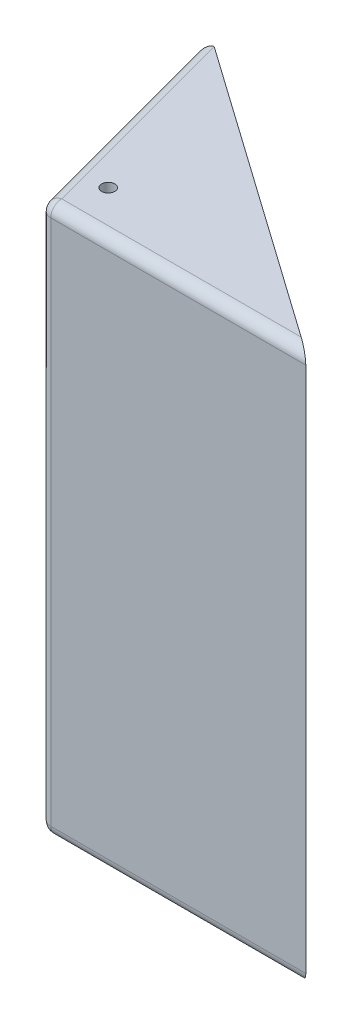
ISO-10303-21;
HEADER;
FILE_DESCRIPTION(('STEP AP214'),'2;1');
FILE_NAME('part.step','',(''),(''),'','','');
FILE_SCHEMA(('AUTOMOTIVE_DESIGN { 1 0 10303 214 1 1 1 1 }'));
ENDSEC;
DATA;
#1=APPLICATION_CONTEXT('core data for automotive mechanical design processes');
#2=APPLICATION_PROTOCOL_DEFINITION('international standard','automotive_design',2000,#1);
#3=PRODUCT_CONTEXT('',#1,'mechanical');
#4=PRODUCT('Part','Part','',(#3));
#5=PRODUCT_RELATED_PRODUCT_CATEGORY('part','',(#4));
#6=PRODUCT_DEFINITION_FORMATION('','',#4);
#7=PRODUCT_DEFINITION_CONTEXT('part definition',#1,'design');
#8=PRODUCT_DEFINITION('design','',#6,#7);
#9=PRODUCT_DEFINITION_SHAPE('','',#8);
#10=(LENGTH_UNIT() NAMED_UNIT(*) SI_UNIT(.MILLI.,.METRE.));
#11=(NAMED_UNIT(*) PLANE_ANGLE_UNIT() SI_UNIT($,.RADIAN.));
#12=(NAMED_UNIT(*) SI_UNIT($,.STERADIAN.) SOLID_ANGLE_UNIT());
#13=UNCERTAINTY_MEASURE_WITH_UNIT(LENGTH_MEASURE(1.E-05),#10,'distance_accuracy_value','');
#14=(GEOMETRIC_REPRESENTATION_CONTEXT(3) GLOBAL_UNCERTAINTY_ASSIGNED_CONTEXT((#13)) GLOBAL_UNIT_ASSIGNED_CONTEXT((#10,
#11,#12)) REPRESENTATION_CONTEXT('',''));
#15=CARTESIAN_POINT('',(0.,0.,0.));
#16=DIRECTION('',(0.,0.,1.));
#17=DIRECTION('',(1.,0.,0.));
#18=AXIS2_PLACEMENT_3D('',#15,#16,#17);
#19=CARTESIAN_POINT('',(0.,3.175,0.));
#20=DIRECTION('',(0.,-1.,0.));
#21=DIRECTION('',(0.,0.,-1.));
#22=AXIS2_PLACEMENT_3D('',#19,#20,#21);
#23=PLANE('',#22);
#24=CARTESIAN_POINT('',(6.35000000000001,3.17500000000001,-12.7));
#25=DIRECTION('',(0.,-1.,0.));
#26=DIRECTION('',(0.,0.,-1.));
#27=AXIS2_PLACEMENT_3D('',#24,#25,#26);
#28=CIRCLE('',#27,1.905);
#29=CARTESIAN_POINT('',(6.35000000000001,3.17500000000001,-14.605));
#30=VERTEX_POINT('',#29);
#31=EDGE_CURVE('E166',#30,#30,#28,.T.);
#32=ORIENTED_EDGE('',*,*,#31,.T.);
#33=EDGE_LOOP('',(#32));
#34=FACE_BOUND('',#33,.T.);
#35=DIRECTION('',(-0.965925826289068,0.,-0.258819045102521));
#36=VECTOR('',#35,1.);
#37=CARTESIAN_POINT('',(5.10443211581291,3.175,-19.05));
#38=LINE('',#37,#36);
#39=CARTESIAN_POINT('',(64.3507386859689,3.175,-3.17499999999999));
#40=VERTEX_POINT('',#39);
#41=CARTESIAN_POINT('',(76.2,3.17500000000001,0.));
#42=VERTEX_POINT('',#41);
#43=EDGE_CURVE('E52',#40,#42,#38,.F.);
#44=ORIENTED_EDGE('',*,*,#43,.T.);
#45=DIRECTION('',(-0.817251084218224,0.,-0.576281758642539));
#46=VECTOR('',#45,1.);
#47=CARTESIAN_POINT('',(25.3060706992233,3.175,-35.887677175414));
#48=LINE('',#47,#46);
#49=CARTESIAN_POINT('',(-13.6987836288058,3.175,-63.3918144984679));
#50=VERTEX_POINT('',#49);
#51=EDGE_CURVE('E199',#42,#50,#48,.T.);
#52=ORIENTED_EDGE('',*,*,#51,.T.);
#53=DIRECTION('',(-0.258819045102518,0.,-0.965925826289069));
#54=VECTOR('',#53,1.);
#55=CARTESIAN_POINT('',(2.43626318683323,3.175,-3.17499999999999));
#56=LINE('',#55,#54);
#57=CARTESIAN_POINT('',(2.43626318683323,3.175,-3.17499999999999));
#58=VERTEX_POINT('',#57);
#59=EDGE_CURVE('E471',#58,#50,#56,.T.);
#60=ORIENTED_EDGE('',*,*,#59,.F.);
#61=DIRECTION('',(-1.,0.,0.));
#62=VECTOR('',#61,1.);
#63=CARTESIAN_POINT('',(76.2,3.175,-3.175));
#64=LINE('',#63,#62);
#65=EDGE_CURVE('E188',#40,#58,#64,.T.);
#66=ORIENTED_EDGE('',*,*,#65,.F.);
#67=EDGE_LOOP('',(#44,#52,#60,#66));
#68=FACE_BOUND('',#67,.T.);
#69=ADVANCED_FACE('F41',(#34,#68),#23,.F.);
#70=CARTESIAN_POINT('',(-17.0147737193762,3.175,-63.5));
#71=DIRECTION('',(0.965925826289069,0.,-0.258819045102519));
#72=DIRECTION('',(-0.258819045102519,0.,-0.965925826289069));
#73=AXIS2_PLACEMENT_3D('',#70,#71,#72);
#74=PLANE('',#73);
#75=DIRECTION('',(0.258819045102519,0.,0.965925826289069));
#76=VECTOR('',#75,1.);
#77=CARTESIAN_POINT('',(-17.0147737193762,155.575,-63.5));
#78=LINE('',#77,#76);
#79=CARTESIAN_POINT('',(-0.63055131163459,155.575,-2.3532495317995));
#80=VERTEX_POINT('',#79);
#81=CARTESIAN_POINT('',(-15.9438476590731,155.575,-59.5032495317995));
#82=VERTEX_POINT('',#81);
#83=EDGE_CURVE('E215',#80,#82,#78,.F.);
#84=ORIENTED_EDGE('',*,*,#83,.T.);
#85=DIRECTION('',(0.,-1.,0.));
#86=VECTOR('',#85,1.);
#87=CARTESIAN_POINT('',(-15.9438476590731,3.175,-59.5032495317995));
#88=LINE('',#87,#86);
#89=CARTESIAN_POINT('',(-15.9438476590731,3.175,-59.5032495317995));
#90=VERTEX_POINT('',#89);
#91=EDGE_CURVE('E157',#82,#90,#88,.T.);
#92=ORIENTED_EDGE('',*,*,#91,.T.);
#93=DIRECTION('',(0.258819045102519,0.,0.965925826289069));
#94=VECTOR('',#93,1.);
#95=CARTESIAN_POINT('',(0.,3.175,0.));
#96=LINE('',#95,#94);
#97=CARTESIAN_POINT('',(-0.63055131163459,3.175,-2.3532495317995));
#98=VERTEX_POINT('',#97);
#99=EDGE_CURVE('E229',#90,#98,#96,.T.);
#100=ORIENTED_EDGE('',*,*,#99,.T.);
#101=DIRECTION('',(0.,-1.,0.));
#102=VECTOR('',#101,1.);
#103=CARTESIAN_POINT('',(-0.63055131163459,3.175,-2.3532495317995));
#104=LINE('',#103,#102);
#105=EDGE_CURVE('E220',#98,#80,#104,.F.);
#106=ORIENTED_EDGE('',*,*,#105,.T.);
#107=EDGE_LOOP('',(#84,#92,#100,#106));
#108=FACE_BOUND('',#107,.T.);
#109=ADVANCED_FACE('F259',(#108),#74,.F.);
#110=CARTESIAN_POINT('',(0.,3.175,0.));
#111=DIRECTION('',(0.,0.,-1.));
#112=DIRECTION('',(-1.,0.,0.));
#113=AXIS2_PLACEMENT_3D('',#110,#111,#112);
#114=PLANE('',#113);
#115=DIRECTION('',(0.,-1.,0.));
#116=VECTOR('',#115,1.);
#117=CARTESIAN_POINT('',(2.4362631868332,3.175,0.));
#118=LINE('',#117,#116);
#119=CARTESIAN_POINT('',(2.4362631868332,155.575,0.));
#120=VERTEX_POINT('',#119);
#121=CARTESIAN_POINT('',(2.4362631868332,3.175,0.));
#122=VERTEX_POINT('',#121);
#123=EDGE_CURVE('E208',#120,#122,#118,.T.);
#124=ORIENTED_EDGE('',*,*,#123,.T.);
#125=DIRECTION('',(1.,0.,0.));
#126=VECTOR('',#125,1.);
#127=CARTESIAN_POINT('',(76.2,3.175,0.));
#128=LINE('',#127,#126);
#129=EDGE_CURVE('E192',#122,#42,#128,.T.);
#130=ORIENTED_EDGE('',*,*,#129,.T.);
#131=DIRECTION('',(0.,-1.,0.));
#132=VECTOR('',#131,1.);
#133=CARTESIAN_POINT('',(76.2,3.175,0.));
#134=LINE('',#133,#132);
#135=CARTESIAN_POINT('',(76.2,155.575,0.));
#136=VERTEX_POINT('',#135);
#137=EDGE_CURVE('E205',#136,#42,#134,.T.);
#138=ORIENTED_EDGE('',*,*,#137,.F.);
#139=DIRECTION('',(1.,0.,0.));
#140=VECTOR('',#139,1.);
#141=CARTESIAN_POINT('',(0.,155.575,0.));
#142=LINE('',#141,#140);
#143=EDGE_CURVE('E245',#136,#120,#142,.F.);
#144=ORIENTED_EDGE('',*,*,#143,.T.);
#145=EDGE_LOOP('',(#124,#130,#138,#144));
#146=FACE_BOUND('',#145,.T.);
#147=ADVANCED_FACE('F204',(#146),#114,.F.);
#148=CARTESIAN_POINT('',(0.,0.,0.));
#149=DIRECTION('',(0.,-1.,0.));
#150=DIRECTION('',(0.,0.,-1.));
#151=AXIS2_PLACEMENT_3D('',#148,#149,#150);
#152=PLANE('',#151);
#153=DIRECTION('',(-0.817251084218224,0.,-0.576281758642539));
#154=VECTOR('',#153,1.);
#155=CARTESIAN_POINT('',(25.3060706992233,0.,-35.887677175414));
#156=LINE('',#155,#154);
#157=CARTESIAN_POINT('',(71.6973896822537,0.,-3.17500000000002));
#158=VERTEX_POINT('',#157);
#159=CARTESIAN_POINT('',(-13.6987836288058,0.,-63.3918144984678));
#160=VERTEX_POINT('',#159);
#161=EDGE_CURVE('E272',#158,#160,#156,.T.);
#162=ORIENTED_EDGE('',*,*,#161,.F.);
#163=DIRECTION('',(1.,0.,0.));
#164=VECTOR('',#163,1.);
#165=CARTESIAN_POINT('',(0.,0.,-3.175));
#166=LINE('',#165,#164);
#167=CARTESIAN_POINT('',(2.4362631868332,0.,-3.175));
#168=VERTEX_POINT('',#167);
#169=EDGE_CURVE('E238',#158,#168,#166,.F.);
#170=ORIENTED_EDGE('',*,*,#169,.T.);
#171=DIRECTION('',(0.258819045102519,0.,0.965925826289069));
#172=VECTOR('',#171,1.);
#173=CARTESIAN_POINT('',(-13.9479592209084,0.,-64.3217504682005));
#174=LINE('',#173,#172);
#175=EDGE_CURVE('E234',#168,#160,#174,.F.);
#176=ORIENTED_EDGE('',*,*,#175,.T.);
#177=EDGE_LOOP('',(#162,#170,#176));
#178=FACE_BOUND('',#177,.T.);
#179=CARTESIAN_POINT('',(6.35000000000001,0.,-12.7));
#180=DIRECTION('',(0.,-1.,0.));
#181=DIRECTION('',(0.,0.,-1.));
#182=AXIS2_PLACEMENT_3D('',#179,#180,#181);
#183=CIRCLE('',#182,1.905);
#184=CARTESIAN_POINT('',(6.35000000000001,0.,-14.605));
#185=VERTEX_POINT('',#184);
#186=EDGE_CURVE('E482',#185,#185,#183,.T.);
#187=ORIENTED_EDGE('',*,*,#186,.F.);
#188=EDGE_LOOP('',(#187));
#189=FACE_BOUND('',#188,.T.);
#190=ADVANCED_FACE('F270',(#178,#189),#152,.T.);
#191=CARTESIAN_POINT('',(76.2,155.575,-3.175));
#192=DIRECTION('',(0.,0.,1.));
#193=DIRECTION('',(1.,0.,0.));
#194=AXIS2_PLACEMENT_3D('',#191,#192,#193);
#195=PLANE('',#194);
#196=DIRECTION('',(-1.,0.,0.));
#197=VECTOR('',#196,1.);
#198=CARTESIAN_POINT('',(76.2,155.575,-3.175));
#199=LINE('',#198,#197);
#200=CARTESIAN_POINT('',(64.3507386859689,155.575,-3.17499999999999));
#201=VERTEX_POINT('',#200);
#202=CARTESIAN_POINT('',(2.43626318683323,155.575,-3.17499999999999));
#203=VERTEX_POINT('',#202);
#204=EDGE_CURVE('E467',#201,#203,#199,.T.);
#205=ORIENTED_EDGE('',*,*,#204,.F.);
#206=DIRECTION('',(0.,-1.,0.));
#207=VECTOR('',#206,1.);
#208=CARTESIAN_POINT('',(64.3507386859689,155.575,-3.17499999999999));
#209=LINE('',#208,#207);
#210=EDGE_CURVE('E189',#201,#40,#209,.T.);
#211=ORIENTED_EDGE('',*,*,#210,.T.);
#212=ORIENTED_EDGE('',*,*,#65,.T.);
#213=DIRECTION('',(0.,-1.,0.));
#214=VECTOR('',#213,1.);
#215=CARTESIAN_POINT('',(2.43626318683323,155.575,-3.17499999999999));
#216=LINE('',#215,#214);
#217=EDGE_CURVE('E216',#203,#58,#216,.T.);
#218=ORIENTED_EDGE('',*,*,#217,.F.);
#219=EDGE_LOOP('',(#205,#211,#212,#218));
#220=FACE_BOUND('',#219,.T.);
#221=ADVANCED_FACE('F294',(#220),#195,.F.);
#222=CARTESIAN_POINT('',(2.43626318683323,155.575,-3.17499999999999));
#223=DIRECTION('',(-0.965925826289069,0.,0.258819045102518));
#224=DIRECTION('',(0.258819045102518,0.,0.965925826289069));
#225=AXIS2_PLACEMENT_3D('',#222,#223,#224);
#226=PLANE('',#225);
#227=ORIENTED_EDGE('',*,*,#59,.T.);
#228=DIRECTION('',(0.,-1.,0.));
#229=VECTOR('',#228,1.);
#230=CARTESIAN_POINT('',(-13.6987836288058,3.175,-63.3918144984678));
#231=LINE('',#230,#229);
#232=CARTESIAN_POINT('',(-13.6987836288058,155.575,-63.3918144984678));
#233=VERTEX_POINT('',#232);
#234=EDGE_CURVE('E152',#50,#233,#231,.F.);
#235=ORIENTED_EDGE('',*,*,#234,.T.);
#236=DIRECTION('',(-0.258819045102518,0.,-0.965925826289069));
#237=VECTOR('',#236,1.);
#238=CARTESIAN_POINT('',(2.43626318683323,155.575,-3.17499999999999));
#239=LINE('',#238,#237);
#240=EDGE_CURVE('E223',#203,#233,#239,.T.);
#241=ORIENTED_EDGE('',*,*,#240,.F.);
#242=ORIENTED_EDGE('',*,*,#217,.T.);
#243=EDGE_LOOP('',(#227,#235,#241,#242));
#244=FACE_BOUND('',#243,.T.);
#245=ADVANCED_FACE('F411',(#244),#226,.F.);
#246=CARTESIAN_POINT('',(0.,158.75,0.));
#247=DIRECTION('',(0.,-1.,0.));
#248=DIRECTION('',(0.,0.,-1.));
#249=AXIS2_PLACEMENT_3D('',#246,#247,#248);
#250=PLANE('',#249);
#251=CARTESIAN_POINT('',(6.35000000000001,158.75,-12.7));
#252=DIRECTION('',(0.,-1.,0.));
#253=DIRECTION('',(0.,0.,-1.));
#254=AXIS2_PLACEMENT_3D('',#251,#252,#253);
#255=CIRCLE('',#254,1.905);
#256=CARTESIAN_POINT('',(6.35000000000001,158.75,-14.605));
#257=VERTEX_POINT('',#256);
#258=EDGE_CURVE('E488',#257,#257,#255,.T.);
#259=ORIENTED_EDGE('',*,*,#258,.T.);
#260=EDGE_LOOP('',(#259));
#261=FACE_BOUND('',#260,.T.);
#262=DIRECTION('',(1.,0.,0.));
#263=VECTOR('',#262,1.);
#264=CARTESIAN_POINT('',(0.,158.75,-3.175));
#265=LINE('',#264,#263);
#266=CARTESIAN_POINT('',(2.4362631868332,158.75,-3.175));
#267=VERTEX_POINT('',#266);
#268=CARTESIAN_POINT('',(71.6973896822537,158.75,-3.17500000000002));
#269=VERTEX_POINT('',#268);
#270=EDGE_CURVE('E139',#267,#269,#265,.T.);
#271=ORIENTED_EDGE('',*,*,#270,.T.);
#272=DIRECTION('',(0.817251084218223,0.,0.576281758642539));
#273=VECTOR('',#272,1.);
#274=CARTESIAN_POINT('',(-13.6987836288058,158.75,-63.3918144984679));
#275=LINE('',#274,#273);
#276=CARTESIAN_POINT('',(-13.6987836288058,158.75,-63.3918144984679));
#277=VERTEX_POINT('',#276);
#278=EDGE_CURVE('E123',#277,#269,#275,.T.);
#279=ORIENTED_EDGE('',*,*,#278,.F.);
#280=DIRECTION('',(0.258819045102519,0.,0.965925826289069));
#281=VECTOR('',#280,1.);
#282=CARTESIAN_POINT('',(3.06681449846779,158.75,-0.821750468200497));
#283=LINE('',#282,#281);
#284=EDGE_CURVE('E137',#277,#267,#283,.T.);
#285=ORIENTED_EDGE('',*,*,#284,.T.);
#286=EDGE_LOOP('',(#271,#279,#285));
#287=FACE_BOUND('',#286,.T.);
#288=ADVANCED_FACE('F136',(#261,#287),#250,.F.);
#289=CARTESIAN_POINT('',(0.,155.575,0.));
#290=DIRECTION('',(0.,-1.,0.));
#291=DIRECTION('',(0.,0.,-1.));
#292=AXIS2_PLACEMENT_3D('',#289,#290,#291);
#293=PLANE('',#292);
#294=DIRECTION('',(-0.817251084218224,0.,-0.576281758642539));
#295=VECTOR('',#294,1.);
#296=CARTESIAN_POINT('',(25.3060706992233,155.575,-35.887677175414));
#297=LINE('',#296,#295);
#298=EDGE_CURVE('E125',#136,#233,#297,.T.);
#299=ORIENTED_EDGE('',*,*,#298,.F.);
#300=DIRECTION('',(0.965925826289068,0.,0.258819045102521));
#301=VECTOR('',#300,1.);
#302=CARTESIAN_POINT('',(64.3507386859689,155.575,-3.17499999999999));
#303=LINE('',#302,#301);
#304=EDGE_CURVE('E11',#136,#201,#303,.F.);
#305=ORIENTED_EDGE('',*,*,#304,.T.);
#306=ORIENTED_EDGE('',*,*,#204,.T.);
#307=ORIENTED_EDGE('',*,*,#240,.T.);
#308=EDGE_LOOP('',(#299,#305,#306,#307));
#309=FACE_BOUND('',#308,.T.);
#310=CARTESIAN_POINT('',(6.35000000000001,155.575,-12.7));
#311=DIRECTION('',(0.,-1.,0.));
#312=DIRECTION('',(0.,0.,-1.));
#313=AXIS2_PLACEMENT_3D('',#310,#311,#312);
#314=CIRCLE('',#313,1.905);
#315=CARTESIAN_POINT('',(6.35000000000001,155.575,-14.605));
#316=VERTEX_POINT('',#315);
#317=EDGE_CURVE('E46',#316,#316,#314,.T.);
#318=ORIENTED_EDGE('',*,*,#317,.F.);
#319=EDGE_LOOP('',(#318));
#320=FACE_BOUND('',#319,.T.);
#321=ADVANCED_FACE('F397',(#309,#320),#293,.T.);
#322=CARTESIAN_POINT('',(0.,155.575,-3.175));
#323=DIRECTION('',(1.,0.,0.));
#324=DIRECTION('',(0.,0.,-1.));
#325=AXIS2_PLACEMENT_3D('',#322,#323,#324);
#326=CYLINDRICAL_SURFACE('',#325,3.175);
#327=CARTESIAN_POINT('',(71.6973896822537,155.575,-3.17500000000002));
#328=DIRECTION('',(-0.576281758642539,0.,0.817251084218224));
#329=DIRECTION('',(0.817251084218224,0.,0.576281758642539));
#330=AXIS2_PLACEMENT_3D('',#327,#328,#329);
#331=ELLIPSE('',#330,5.50945774768035,3.175);
#332=EDGE_CURVE('E483',#269,#136,#331,.F.);
#333=ORIENTED_EDGE('',*,*,#332,.F.);
#334=ORIENTED_EDGE('',*,*,#270,.F.);
#335=CARTESIAN_POINT('',(2.4362631868332,155.575,-3.175));
#336=DIRECTION('',(-1.,0.,0.));
#337=DIRECTION('',(0.,0.,1.));
#338=AXIS2_PLACEMENT_3D('',#335,#336,#337);
#339=CIRCLE('',#338,3.175);
#340=EDGE_CURVE('E184',#120,#267,#339,.T.);
#341=ORIENTED_EDGE('',*,*,#340,.F.);
#342=ORIENTED_EDGE('',*,*,#143,.F.);
#343=EDGE_LOOP('',(#333,#334,#341,#342));
#344=FACE_BOUND('',#343,.T.);
#345=ADVANCED_FACE('F255',(#344),#326,.T.);
#346=CARTESIAN_POINT('',(2.4362631868332,3.175,-3.175));
#347=DIRECTION('',(0.,-1.,0.));
#348=DIRECTION('',(0.,0.,-1.));
#349=AXIS2_PLACEMENT_3D('',#346,#347,#348);
#350=CYLINDRICAL_SURFACE('',#349,3.175);
#351=CARTESIAN_POINT('',(2.4362631868332,3.175,-3.175));
#352=DIRECTION('',(0.,-1.,0.));
#353=DIRECTION('',(0.,0.,-1.));
#354=AXIS2_PLACEMENT_3D('',#351,#352,#353);
#355=CIRCLE('',#354,3.175);
#356=EDGE_CURVE('E176',#122,#98,#355,.T.);
#357=ORIENTED_EDGE('',*,*,#356,.F.);
#358=ORIENTED_EDGE('',*,*,#123,.F.);
#359=CARTESIAN_POINT('',(2.4362631868332,155.575,-3.175));
#360=DIRECTION('',(0.,1.,0.));
#361=DIRECTION('',(0.,0.,1.));
#362=AXIS2_PLACEMENT_3D('',#359,#360,#361);
#363=CIRCLE('',#362,3.175);
#364=EDGE_CURVE('E180',#80,#120,#363,.T.);
#365=ORIENTED_EDGE('',*,*,#364,.F.);
#366=ORIENTED_EDGE('',*,*,#105,.F.);
#367=EDGE_LOOP('',(#357,#358,#365,#366));
#368=FACE_BOUND('',#367,.T.);
#369=ADVANCED_FACE('F253',(#368),#350,.T.);
#370=CARTESIAN_POINT('',(0.,3.175,-3.175));
#371=DIRECTION('',(-1.,0.,0.));
#372=DIRECTION('',(0.,0.,1.));
#373=AXIS2_PLACEMENT_3D('',#370,#371,#372);
#374=CYLINDRICAL_SURFACE('',#373,3.175);
#375=CARTESIAN_POINT('',(71.6973896822537,3.175,-3.17500000000002));
#376=DIRECTION('',(-0.576281758642539,0.,0.817251084218224));
#377=DIRECTION('',(-0.817251084218224,0.,-0.576281758642539));
#378=AXIS2_PLACEMENT_3D('',#375,#376,#377);
#379=ELLIPSE('',#378,5.50945774768035,3.175);
#380=EDGE_CURVE('E275',#42,#158,#379,.F.);
#381=ORIENTED_EDGE('',*,*,#380,.F.);
#382=ORIENTED_EDGE('',*,*,#129,.F.);
#383=CARTESIAN_POINT('',(2.4362631868332,3.175,-3.175));
#384=DIRECTION('',(-1.,0.,0.));
#385=DIRECTION('',(0.,0.,1.));
#386=AXIS2_PLACEMENT_3D('',#383,#384,#385);
#387=CIRCLE('',#386,3.175);
#388=EDGE_CURVE('E172',#168,#122,#387,.T.);
#389=ORIENTED_EDGE('',*,*,#388,.F.);
#390=ORIENTED_EDGE('',*,*,#169,.F.);
#391=EDGE_LOOP('',(#381,#382,#389,#390));
#392=FACE_BOUND('',#391,.T.);
#393=ADVANCED_FACE('F274',(#392),#374,.T.);
#394=CARTESIAN_POINT('',(2.4362631868332,155.575,-3.175));
#395=DIRECTION('',(0.,1.,0.));
#396=DIRECTION('',(-1.,0.,0.));
#397=AXIS2_PLACEMENT_3D('',#394,#395,#396);
#398=SPHERICAL_SURFACE('',#397,3.175);
#399=ORIENTED_EDGE('',*,*,#364,.T.);
#400=ORIENTED_EDGE('',*,*,#340,.T.);
#401=CARTESIAN_POINT('',(2.4362631868332,155.575,-3.175));
#402=DIRECTION('',(0.258819045102519,0.,0.965925826289069));
#403=DIRECTION('',(0.965925826289069,0.,-0.258819045102519));
#404=AXIS2_PLACEMENT_3D('',#401,#402,#403);
#405=CIRCLE('',#404,3.175);
#406=EDGE_CURVE('E150',#80,#267,#405,.F.);
#407=ORIENTED_EDGE('',*,*,#406,.F.);
#408=EDGE_LOOP('',(#399,#400,#407));
#409=FACE_BOUND('',#408,.T.);
#410=ADVANCED_FACE('F257',(#409),#398,.T.);
#411=CARTESIAN_POINT('',(2.4362631868332,3.175,-3.175));
#412=DIRECTION('',(0.,-1.,0.));
#413=DIRECTION('',(1.,0.,0.));
#414=AXIS2_PLACEMENT_3D('',#411,#412,#413);
#415=SPHERICAL_SURFACE('',#414,3.175);
#416=ORIENTED_EDGE('',*,*,#388,.T.);
#417=ORIENTED_EDGE('',*,*,#356,.T.);
#418=CARTESIAN_POINT('',(2.4362631868332,3.175,-3.175));
#419=DIRECTION('',(0.258819045102519,0.,0.965925826289069));
#420=DIRECTION('',(0.965925826289069,0.,-0.258819045102519));
#421=AXIS2_PLACEMENT_3D('',#418,#419,#420);
#422=CIRCLE('',#421,3.175);
#423=EDGE_CURVE('E159',#168,#98,#422,.F.);
#424=ORIENTED_EDGE('',*,*,#423,.F.);
#425=EDGE_LOOP('',(#416,#417,#424));
#426=FACE_BOUND('',#425,.T.);
#427=ADVANCED_FACE('F263',(#426),#415,.T.);
#428=CARTESIAN_POINT('',(3.06681449846779,155.575,-0.821750468200496));
#429=DIRECTION('',(0.258819045102519,0.,0.965925826289069));
#430=DIRECTION('',(0.965925826289069,0.,-0.258819045102519));
#431=AXIS2_PLACEMENT_3D('',#428,#429,#430);
#432=CYLINDRICAL_SURFACE('',#431,3.175);
#433=ORIENTED_EDGE('',*,*,#406,.T.);
#434=ORIENTED_EDGE('',*,*,#284,.F.);
#435=CARTESIAN_POINT('',(-12.8770331606053,155.575,-60.325));
#436=DIRECTION('',(0.183012701892218,0.707106781186547,0.68301270189222));
#437=DIRECTION('',(0.183012701892218,-0.707106781186547,0.68301270189222));
#438=AXIS2_PLACEMENT_3D('',#435,#436,#437);
#439=ELLIPSE('',#438,4.49012806053458,3.175);
#440=EDGE_CURVE('E147',#82,#277,#439,.F.);
#441=ORIENTED_EDGE('',*,*,#440,.F.);
#442=ORIENTED_EDGE('',*,*,#83,.F.);
#443=EDGE_LOOP('',(#433,#434,#441,#442));
#444=FACE_BOUND('',#443,.T.);
#445=ADVANCED_FACE('F145',(#444),#432,.T.);
#446=CARTESIAN_POINT('',(-13.9479592209084,3.175,-64.3217504682005));
#447=DIRECTION('',(-0.258819045102519,0.,-0.965925826289069));
#448=DIRECTION('',(-0.965925826289069,0.,0.258819045102519));
#449=AXIS2_PLACEMENT_3D('',#446,#447,#448);
#450=CYLINDRICAL_SURFACE('',#449,3.175);
#451=ORIENTED_EDGE('',*,*,#423,.T.);
#452=ORIENTED_EDGE('',*,*,#99,.F.);
#453=CARTESIAN_POINT('',(-12.8770331606053,3.175,-60.325));
#454=DIRECTION('',(-0.183012701892218,0.707106781186547,-0.68301270189222));
#455=DIRECTION('',(-0.183012701892218,-0.707106781186547,-0.68301270189222));
#456=AXIS2_PLACEMENT_3D('',#453,#454,#455);
#457=ELLIPSE('',#456,4.49012806053458,3.175);
#458=EDGE_CURVE('E160',#160,#90,#457,.T.);
#459=ORIENTED_EDGE('',*,*,#458,.F.);
#460=ORIENTED_EDGE('',*,*,#175,.F.);
#461=EDGE_LOOP('',(#451,#452,#459,#460));
#462=FACE_BOUND('',#461,.T.);
#463=ADVANCED_FACE('F266',(#462),#450,.T.);
#464=CARTESIAN_POINT('',(-12.8770331606053,3.175,-60.325));
#465=DIRECTION('',(0.,-1.,0.));
#466=DIRECTION('',(0.,0.,-1.));
#467=AXIS2_PLACEMENT_3D('',#464,#465,#466);
#468=CYLINDRICAL_SURFACE('',#467,3.175);
#469=DIRECTION('',(0.,1.,0.));
#470=VECTOR('',#469,1.);
#471=CARTESIAN_POINT('',(-13.6987836288058,-95.25,-63.3918144984679));
#472=LINE('',#471,#470);
#473=EDGE_CURVE('E131',#160,#50,#472,.T.);
#474=ORIENTED_EDGE('',*,*,#473,.F.);
#475=ORIENTED_EDGE('',*,*,#458,.T.);
#476=ORIENTED_EDGE('',*,*,#91,.F.);
#477=ORIENTED_EDGE('',*,*,#440,.T.);
#478=EDGE_CURVE('E120',#233,#277,#472,.T.);
#479=ORIENTED_EDGE('',*,*,#478,.F.);
#480=ORIENTED_EDGE('',*,*,#234,.F.);
#481=EDGE_LOOP('',(#474,#475,#476,#477,#479,#480));
#482=FACE_BOUND('',#481,.T.);
#483=ADVANCED_FACE('F155',(#482),#468,.T.);
#484=CARTESIAN_POINT('',(64.3507386859689,155.575,-3.17499999999999));
#485=DIRECTION('',(-0.258819045102521,0.,0.965925826289068));
#486=DIRECTION('',(0.,-1.,0.));
#487=AXIS2_PLACEMENT_3D('',#484,#485,#486);
#488=PLANE('',#487);
#489=ORIENTED_EDGE('',*,*,#304,.F.);
#490=ORIENTED_EDGE('',*,*,#137,.T.);
#491=ORIENTED_EDGE('',*,*,#43,.F.);
#492=ORIENTED_EDGE('',*,*,#210,.F.);
#493=EDGE_LOOP('',(#489,#490,#491,#492));
#494=FACE_BOUND('',#493,.T.);
#495=ADVANCED_FACE('F44',(#494),#488,.F.);
#496=CARTESIAN_POINT('',(6.35000000000001,158.75,-12.7));
#497=DIRECTION('',(0.,-1.,0.));
#498=DIRECTION('',(0.,0.,-1.));
#499=AXIS2_PLACEMENT_3D('',#496,#497,#498);
#500=CYLINDRICAL_SURFACE('',#499,1.905);
#501=CARTESIAN_POINT('',(6.35000000000001,155.575,-14.605));
#502=CARTESIAN_POINT('',(6.35000000000001,155.608072916667,-14.605));
#503=CARTESIAN_POINT('',(6.35000000000001,155.641145833333,-14.605));
#504=CARTESIAN_POINT('',(6.35000000000001,155.707291666667,-14.605));
#505=CARTESIAN_POINT('',(6.35000000000001,155.740364583333,-14.605));
#506=CARTESIAN_POINT('',(6.35000000000001,155.806510416667,-14.605));
#507=CARTESIAN_POINT('',(6.35000000000001,155.839583333333,-14.605));
#508=CARTESIAN_POINT('',(6.35000000000001,155.905729166667,-14.605));
#509=CARTESIAN_POINT('',(6.35000000000001,155.938802083333,-14.605));
#510=CARTESIAN_POINT('',(6.35000000000001,156.004947916667,-14.605));
#511=CARTESIAN_POINT('',(6.35000000000001,156.038020833333,-14.605));
#512=CARTESIAN_POINT('',(6.35000000000001,156.104166666667,-14.605));
#513=CARTESIAN_POINT('',(6.35000000000001,156.137239583333,-14.605));
#514=CARTESIAN_POINT('',(6.35000000000001,156.203385416667,-14.605));
#515=CARTESIAN_POINT('',(6.35000000000001,156.236458333333,-14.605));
#516=CARTESIAN_POINT('',(6.35000000000001,156.302604166667,-14.605));
#517=CARTESIAN_POINT('',(6.35000000000001,156.335677083333,-14.605));
#518=CARTESIAN_POINT('',(6.35000000000001,156.401822916667,-14.605));
#519=CARTESIAN_POINT('',(6.35000000000001,156.434895833333,-14.605));
#520=CARTESIAN_POINT('',(6.35000000000001,156.501041666667,-14.605));
#521=CARTESIAN_POINT('',(6.35000000000001,156.534114583333,-14.605));
#522=CARTESIAN_POINT('',(6.35000000000001,156.600260416667,-14.605));
#523=CARTESIAN_POINT('',(6.35000000000001,156.633333333333,-14.605));
#524=CARTESIAN_POINT('',(6.35000000000001,156.699479166667,-14.605));
#525=CARTESIAN_POINT('',(6.35000000000001,156.732552083333,-14.605));
#526=CARTESIAN_POINT('',(6.35000000000001,156.798697916667,-14.605));
#527=CARTESIAN_POINT('',(6.35000000000001,156.831770833333,-14.605));
#528=CARTESIAN_POINT('',(6.35000000000001,156.897916666667,-14.605));
#529=CARTESIAN_POINT('',(6.35000000000001,156.930989583333,-14.605));
#530=CARTESIAN_POINT('',(6.35000000000001,156.997135416667,-14.605));
#531=CARTESIAN_POINT('',(6.35000000000001,157.030208333333,-14.605));
#532=CARTESIAN_POINT('',(6.35000000000001,157.096354166667,-14.605));
#533=CARTESIAN_POINT('',(6.35000000000001,157.129427083333,-14.605));
#534=CARTESIAN_POINT('',(6.35000000000001,157.195572916667,-14.605));
#535=CARTESIAN_POINT('',(6.35000000000001,157.228645833333,-14.605));
#536=CARTESIAN_POINT('',(6.35000000000001,157.294791666667,-14.605));
#537=CARTESIAN_POINT('',(6.35000000000001,157.327864583333,-14.605));
#538=CARTESIAN_POINT('',(6.35000000000001,157.394010416667,-14.605));
#539=CARTESIAN_POINT('',(6.35000000000001,157.427083333333,-14.605));
#540=CARTESIAN_POINT('',(6.35000000000001,157.493229166667,-14.605));
#541=CARTESIAN_POINT('',(6.35000000000001,157.526302083333,-14.605));
#542=CARTESIAN_POINT('',(6.35000000000001,157.592447916667,-14.605));
#543=CARTESIAN_POINT('',(6.35000000000001,157.625520833333,-14.605));
#544=CARTESIAN_POINT('',(6.35000000000001,157.691666666667,-14.605));
#545=CARTESIAN_POINT('',(6.35000000000001,157.724739583333,-14.605));
#546=CARTESIAN_POINT('',(6.35000000000001,157.790885416667,-14.605));
#547=CARTESIAN_POINT('',(6.35000000000001,157.823958333333,-14.605));
#548=CARTESIAN_POINT('',(6.35000000000001,157.890104166667,-14.605));
#549=CARTESIAN_POINT('',(6.35000000000001,157.923177083333,-14.605));
#550=CARTESIAN_POINT('',(6.35000000000001,157.989322916667,-14.605));
#551=CARTESIAN_POINT('',(6.35000000000001,158.022395833333,-14.605));
#552=CARTESIAN_POINT('',(6.35000000000001,158.088541666667,-14.605));
#553=CARTESIAN_POINT('',(6.35000000000001,158.121614583333,-14.605));
#554=CARTESIAN_POINT('',(6.35000000000001,158.187760416667,-14.605));
#555=CARTESIAN_POINT('',(6.35000000000001,158.220833333333,-14.605));
#556=CARTESIAN_POINT('',(6.35000000000001,158.286979166667,-14.605));
#557=CARTESIAN_POINT('',(6.35000000000001,158.320052083333,-14.605));
#558=CARTESIAN_POINT('',(6.35000000000001,158.386197916667,-14.605));
#559=CARTESIAN_POINT('',(6.35000000000001,158.419270833333,-14.605));
#560=CARTESIAN_POINT('',(6.35000000000001,158.485416666667,-14.605));
#561=CARTESIAN_POINT('',(6.35000000000001,158.518489583333,-14.605));
#562=CARTESIAN_POINT('',(6.35000000000001,158.584635416667,-14.605));
#563=CARTESIAN_POINT('',(6.35000000000001,158.617708333333,-14.605));
#564=CARTESIAN_POINT('',(6.35000000000001,158.683854166667,-14.605));
#565=CARTESIAN_POINT('',(6.35000000000001,158.716927083333,-14.605));
#566=CARTESIAN_POINT('',(6.35000000000001,158.75,-14.605));
#567=B_SPLINE_CURVE_WITH_KNOTS('',3,(#501,#502,#503,#504,#505,#506,#507,#508,#509,#510,#511,
#512,#513,#514,#515,#516,#517,#518,#519,#520,#521,#522,#523,#524,#525,#526,#527,#528,#529,#530,
#531,#532,#533,#534,#535,#536,#537,#538,#539,#540,#541,#542,#543,#544,#545,#546,#547,#548,#549,
#550,#551,#552,#553,#554,#555,#556,#557,#558,#559,#560,#561,#562,#563,#564,#565,#566),
.UNSPECIFIED.,.F.,.F.,(4,2,2,2,2,2,2,2,2,2,2,2,2,2,2,2,2,2,2,2,2,2,2,2,2,2,2,2,2,2,2,2,4),(0.,
0.0992187499999908,0.198437499999982,0.297656249999972,0.396874999999991,0.496093749999982,
0.595312499999973,0.694531249999991,0.793749999999982,0.892968749999973,0.992187499999991,
1.09140624999998,1.19062499999997,1.28984374999999,1.38906249999998,1.48828124999997,
1.58749999999999,1.68671874999998,1.78593749999997,1.88515624999996,1.98437499999998,
2.08359374999997,2.18281249999996,2.28203124999998,2.38124999999997,2.48046874999996,
2.57968749999998,2.67890624999997,2.77812499999996,2.87734374999998,2.97656249999997,
3.07578124999996,3.17499999999996),.UNSPECIFIED.);
#568=EDGE_CURVE('BSEAM330',#316,#257,#567,.T.);
#569=ORIENTED_EDGE('',*,*,#317,.T.);
#570=ORIENTED_EDGE('',*,*,#258,.F.);
#571=ORIENTED_EDGE('',*,*,#568,.T.);
#572=ORIENTED_EDGE('',*,*,#568,.F.);
#573=EDGE_LOOP('',(#569,#571,#570,#572));
#574=FACE_BOUND('',#573,.T.);
#575=ADVANCED_FACE('F330',(#574),#500,.F.);
#576=CARTESIAN_POINT('',(6.35000000000001,0.,-14.605));
#577=CARTESIAN_POINT('',(6.35000000000001,0.0330729166666914,-14.605));
#578=CARTESIAN_POINT('',(6.35000000000001,0.066145833333355,-14.605));
#579=CARTESIAN_POINT('',(6.35000000000001,0.132291666666691,-14.605));
#580=CARTESIAN_POINT('',(6.35000000000001,0.165364583333364,-14.605));
#581=CARTESIAN_POINT('',(6.35000000000001,0.231510416666701,-14.605));
#582=CARTESIAN_POINT('',(6.35000000000001,0.264583333333364,-14.605));
#583=CARTESIAN_POINT('',(6.35000000000001,0.330729166666692,-14.605));
#584=CARTESIAN_POINT('',(6.35000000000001,0.363802083333355,-14.605));
#585=CARTESIAN_POINT('',(6.35000000000001,0.429947916666692,-14.605));
#586=CARTESIAN_POINT('',(6.35000000000001,0.463020833333364,-14.605));
#587=CARTESIAN_POINT('',(6.35000000000001,0.529166666666701,-14.605));
#588=CARTESIAN_POINT('',(6.35000000000001,0.562239583333365,-14.605));
#589=CARTESIAN_POINT('',(6.35000000000001,0.628385416666692,-14.605));
#590=CARTESIAN_POINT('',(6.35000000000001,0.661458333333355,-14.605));
#591=CARTESIAN_POINT('',(6.35000000000001,0.727604166666682,-14.605));
#592=CARTESIAN_POINT('',(6.35000000000001,0.760677083333346,-14.605));
#593=CARTESIAN_POINT('',(6.35000000000001,0.826822916666683,-14.605));
#594=CARTESIAN_POINT('',(6.35000000000001,0.859895833333355,-14.605));
#595=CARTESIAN_POINT('',(6.35000000000001,0.926041666666692,-14.605));
#596=CARTESIAN_POINT('',(6.35000000000001,0.959114583333356,-14.605));
#597=CARTESIAN_POINT('',(6.35000000000001,1.02526041666668,-14.605));
#598=CARTESIAN_POINT('',(6.35000000000001,1.05833333333335,-14.605));
#599=CARTESIAN_POINT('',(6.35000000000001,1.12447916666668,-14.605));
#600=CARTESIAN_POINT('',(6.35000000000001,1.15755208333336,-14.605));
#601=CARTESIAN_POINT('',(6.35000000000001,1.22369791666669,-14.605));
#602=CARTESIAN_POINT('',(6.35000000000001,1.25677083333336,-14.605));
#603=CARTESIAN_POINT('',(6.35000000000001,1.32291666666668,-14.605));
#604=CARTESIAN_POINT('',(6.35000000000001,1.35598958333335,-14.605));
#605=CARTESIAN_POINT('',(6.35000000000001,1.42213541666668,-14.605));
#606=CARTESIAN_POINT('',(6.35000000000001,1.45520833333336,-14.605));
#607=CARTESIAN_POINT('',(6.35000000000001,1.52135416666669,-14.605));
#608=CARTESIAN_POINT('',(6.35000000000001,1.55442708333336,-14.605));
#609=CARTESIAN_POINT('',(6.35000000000001,1.62057291666668,-14.605));
#610=CARTESIAN_POINT('',(6.35000000000001,1.65364583333335,-14.605));
#611=CARTESIAN_POINT('',(6.35000000000001,1.71979166666668,-14.605));
#612=CARTESIAN_POINT('',(6.35000000000001,1.75286458333336,-14.605));
#613=CARTESIAN_POINT('',(6.35000000000001,1.81901041666669,-14.605));
#614=CARTESIAN_POINT('',(6.35000000000001,1.85208333333336,-14.605));
#615=CARTESIAN_POINT('',(6.35000000000001,1.91822916666668,-14.605));
#616=CARTESIAN_POINT('',(6.35000000000001,1.95130208333335,-14.605));
#617=CARTESIAN_POINT('',(6.35000000000001,2.01744791666668,-14.605));
#618=CARTESIAN_POINT('',(6.35000000000001,2.05052083333336,-14.605));
#619=CARTESIAN_POINT('',(6.35000000000001,2.11666666666669,-14.605));
#620=CARTESIAN_POINT('',(6.35000000000001,2.14973958333336,-14.605));
#621=CARTESIAN_POINT('',(6.35000000000001,2.21588541666668,-14.605));
#622=CARTESIAN_POINT('',(6.35000000000001,2.24895833333335,-14.605));
#623=CARTESIAN_POINT('',(6.35000000000001,2.31510416666668,-14.605));
#624=CARTESIAN_POINT('',(6.35000000000001,2.34817708333336,-14.605));
#625=CARTESIAN_POINT('',(6.35000000000001,2.41432291666669,-14.605));
#626=CARTESIAN_POINT('',(6.35000000000001,2.44739583333336,-14.605));
#627=CARTESIAN_POINT('',(6.35000000000001,2.51354166666668,-14.605));
#628=CARTESIAN_POINT('',(6.35000000000001,2.54661458333335,-14.605));
#629=CARTESIAN_POINT('',(6.35000000000001,2.61276041666667,-14.605));
#630=CARTESIAN_POINT('',(6.35000000000001,2.64583333333334,-14.605));
#631=CARTESIAN_POINT('',(6.35000000000001,2.71197916666667,-14.605));
#632=CARTESIAN_POINT('',(6.35000000000001,2.74505208333335,-14.605));
#633=CARTESIAN_POINT('',(6.35000000000001,2.81119791666668,-14.605));
#634=CARTESIAN_POINT('',(6.35000000000001,2.84427083333335,-14.605));
#635=CARTESIAN_POINT('',(6.35000000000001,2.91041666666667,-14.605));
#636=CARTESIAN_POINT('',(6.35000000000001,2.94348958333334,-14.605));
#637=CARTESIAN_POINT('',(6.35000000000001,3.00963541666667,-14.605));
#638=CARTESIAN_POINT('',(6.35000000000001,3.04270833333335,-14.605));
#639=CARTESIAN_POINT('',(6.35000000000001,3.10885416666668,-14.605));
#640=CARTESIAN_POINT('',(6.35000000000001,3.14192708333335,-14.605));
#641=CARTESIAN_POINT('',(6.35000000000001,3.17500000000001,-14.605));
#642=B_SPLINE_CURVE_WITH_KNOTS('',3,(#576,#577,#578,#579,#580,#581,#582,#583,#584,#585,#586,
#587,#588,#589,#590,#591,#592,#593,#594,#595,#596,#597,#598,#599,#600,#601,#602,#603,#604,#605,
#606,#607,#608,#609,#610,#611,#612,#613,#614,#615,#616,#617,#618,#619,#620,#621,#622,#623,#624,
#625,#626,#627,#628,#629,#630,#631,#632,#633,#634,#635,#636,#637,#638,#639,#640,#641),
.UNSPECIFIED.,.F.,.F.,(4,2,2,2,2,2,2,2,2,2,2,2,2,2,2,2,2,2,2,2,2,2,2,2,2,2,2,2,2,2,2,2,4),(0.,
0.0992187499999908,0.198437500000009,0.29765625,0.396874999999991,0.49609375000001,0.5953125,
0.694531249999991,0.793749999999982,0.892968750000001,0.992187499999991,1.09140624999998,
1.190625,1.28984374999999,1.38906249999998,1.48828125,1.58749999999999,1.68671874999998,
1.7859375,1.88515624999999,1.98437499999998,2.08359375,2.18281249999999,2.28203124999998,
2.38125,2.48046874999999,2.57968749999998,2.67890624999997,2.77812499999999,2.87734374999998,
2.97656249999997,3.07578124999999,3.17499999999998),.UNSPECIFIED.);
#643=EDGE_CURVE('BSEAM337',#185,#30,#642,.T.);
#644=ORIENTED_EDGE('',*,*,#186,.T.);
#645=ORIENTED_EDGE('',*,*,#31,.F.);
#646=ORIENTED_EDGE('',*,*,#643,.T.);
#647=ORIENTED_EDGE('',*,*,#643,.F.);
#648=EDGE_LOOP('',(#644,#646,#645,#647));
#649=FACE_BOUND('',#648,.T.);
#650=ADVANCED_FACE('F337',(#649),#500,.F.);
#651=CARTESIAN_POINT('',(-13.6987836288058,-95.25,-63.3918144984679));
#652=DIRECTION('',(-0.576281758642539,0.,0.817251084218224));
#653=DIRECTION('',(0.817251084218224,0.,0.576281758642539));
#654=AXIS2_PLACEMENT_3D('',#651,#652,#653);
#655=PLANE('',#654);
#656=ORIENTED_EDGE('',*,*,#298,.T.);
#657=ORIENTED_EDGE('',*,*,#478,.T.);
#658=ORIENTED_EDGE('',*,*,#278,.T.);
#659=ORIENTED_EDGE('',*,*,#332,.T.);
#660=EDGE_LOOP('',(#656,#657,#658,#659));
#661=FACE_BOUND('',#660,.T.);
#662=ADVANCED_FACE('F122',(#661),#655,.F.);
#663=ORIENTED_EDGE('',*,*,#380,.T.);
#664=ORIENTED_EDGE('',*,*,#161,.T.);
#665=ORIENTED_EDGE('',*,*,#473,.T.);
#666=ORIENTED_EDGE('',*,*,#51,.F.);
#667=EDGE_LOOP('',(#663,#664,#665,#666));
#668=FACE_BOUND('',#667,.T.);
#669=ADVANCED_FACE('F350',(#668),#655,.F.);
#670=CLOSED_SHELL('',(#69,#109,#147,#190,#221,#245,#288,#321,#345,#369,#393,#410,#427,#445,#463,
#483,#495,#575,#650,#662,#669));
#671=MANIFOLD_SOLID_BREP('B2',#670);
#672=ADVANCED_BREP_SHAPE_REPRESENTATION('',(#18,#671),#14);
#673=SHAPE_DEFINITION_REPRESENTATION(#9,#672);
ENDSEC;
END-ISO-10303-21;
